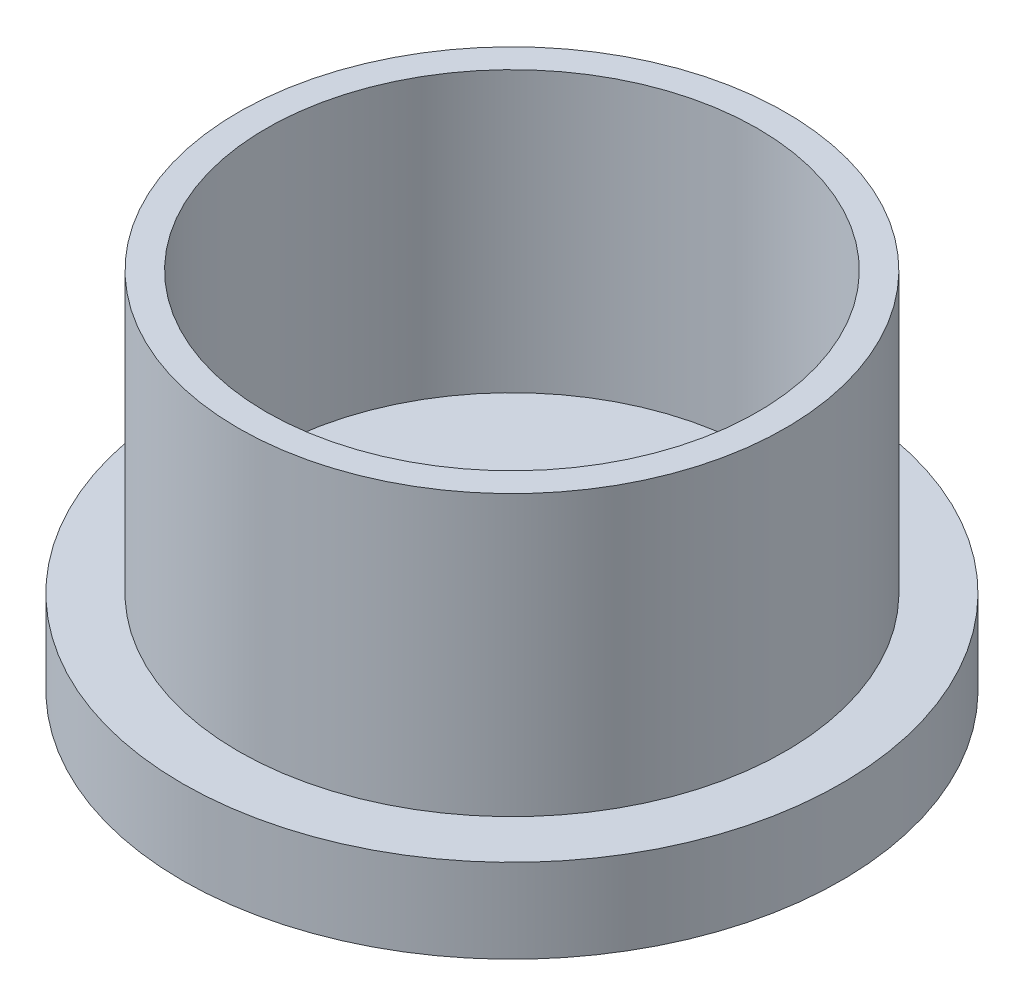
ISO-10303-21;
HEADER;
FILE_DESCRIPTION(('STEP AP214'),'2;1');
FILE_NAME('part.step','',(''),(''),'','','');
FILE_SCHEMA(('AUTOMOTIVE_DESIGN { 1 0 10303 214 1 1 1 1 }'));
ENDSEC;
DATA;
#1=APPLICATION_CONTEXT('core data for automotive mechanical design processes');
#2=APPLICATION_PROTOCOL_DEFINITION('international standard','automotive_design',2000,#1);
#3=PRODUCT_CONTEXT('',#1,'mechanical');
#4=PRODUCT('Part','Part','',(#3));
#5=PRODUCT_RELATED_PRODUCT_CATEGORY('part','',(#4));
#6=PRODUCT_DEFINITION_FORMATION('','',#4);
#7=PRODUCT_DEFINITION_CONTEXT('part definition',#1,'design');
#8=PRODUCT_DEFINITION('design','',#6,#7);
#9=PRODUCT_DEFINITION_SHAPE('','',#8);
#10=(LENGTH_UNIT() NAMED_UNIT(*) SI_UNIT(.MILLI.,.METRE.));
#11=(NAMED_UNIT(*) PLANE_ANGLE_UNIT() SI_UNIT($,.RADIAN.));
#12=(NAMED_UNIT(*) SI_UNIT($,.STERADIAN.) SOLID_ANGLE_UNIT());
#13=UNCERTAINTY_MEASURE_WITH_UNIT(LENGTH_MEASURE(1.E-05),#10,'distance_accuracy_value','');
#14=(GEOMETRIC_REPRESENTATION_CONTEXT(3) GLOBAL_UNCERTAINTY_ASSIGNED_CONTEXT((#13)) GLOBAL_UNIT_ASSIGNED_CONTEXT((#10,
#11,#12)) REPRESENTATION_CONTEXT('',''));
#15=CARTESIAN_POINT('',(0.,0.,0.));
#16=DIRECTION('',(0.,0.,1.));
#17=DIRECTION('',(1.,0.,0.));
#18=AXIS2_PLACEMENT_3D('',#15,#16,#17);
#19=CARTESIAN_POINT('',(-7.78,0.,-0.25));
#20=DIRECTION('',(0.,0.,1.));
#21=DIRECTION('',(1.,0.,0.));
#22=AXIS2_PLACEMENT_3D('',#19,#20,#21);
#23=PLANE('',#22);
#24=DIRECTION('',(0.,1.,0.));
#25=VECTOR('',#24,1.);
#26=CARTESIAN_POINT('',(0.25,0.,-0.25));
#27=LINE('',#26,#25);
#28=CARTESIAN_POINT('',(0.25,0.,-0.25));
#29=VERTEX_POINT('',#28);
#30=CARTESIAN_POINT('',(0.25,3.,-0.25));
#31=VERTEX_POINT('',#30);
#32=EDGE_CURVE('E142',#29,#31,#27,.T.);
#33=ORIENTED_EDGE('',*,*,#32,.F.);
#34=DIRECTION('',(1.,0.,0.));
#35=VECTOR('',#34,1.);
#36=CARTESIAN_POINT('',(-7.78,0.,-0.25));
#37=LINE('',#36,#35);
#38=CARTESIAN_POINT('',(7.78,0.,-0.25));
#39=VERTEX_POINT('',#38);
#40=EDGE_CURVE('E175',#29,#39,#37,.T.);
#41=ORIENTED_EDGE('',*,*,#40,.T.);
#42=DIRECTION('',(0.,1.,0.));
#43=VECTOR('',#42,1.);
#44=CARTESIAN_POINT('',(7.78,0.,-0.25));
#45=LINE('',#44,#43);
#46=CARTESIAN_POINT('',(7.78,3.,-0.25));
#47=VERTEX_POINT('',#46);
#48=EDGE_CURVE('E194',#39,#47,#45,.T.);
#49=ORIENTED_EDGE('',*,*,#48,.T.);
#50=DIRECTION('',(1.,0.,0.));
#51=VECTOR('',#50,1.);
#52=CARTESIAN_POINT('',(-7.78,3.,-0.25));
#53=LINE('',#52,#51);
#54=EDGE_CURVE('E188',#31,#47,#53,.T.);
#55=ORIENTED_EDGE('',*,*,#54,.F.);
#56=EDGE_LOOP('',(#33,#41,#49,#55));
#57=FACE_BOUND('',#56,.T.);
#58=ADVANCED_FACE('F33',(#57),#23,.T.);
#59=CARTESIAN_POINT('',(-7.78,0.,0.25));
#60=DIRECTION('',(0.,0.,1.));
#61=DIRECTION('',(1.,0.,0.));
#62=AXIS2_PLACEMENT_3D('',#59,#60,#61);
#63=PLANE('',#62);
#64=DIRECTION('',(1.,0.,0.));
#65=VECTOR('',#64,1.);
#66=CARTESIAN_POINT('',(-7.78,0.,0.25));
#67=LINE('',#66,#65);
#68=CARTESIAN_POINT('',(0.25,0.,0.25));
#69=VERTEX_POINT('',#68);
#70=CARTESIAN_POINT('',(7.78,0.,0.25));
#71=VERTEX_POINT('',#70);
#72=EDGE_CURVE('E56',#69,#71,#67,.T.);
#73=ORIENTED_EDGE('',*,*,#72,.F.);
#74=DIRECTION('',(0.,1.,0.));
#75=VECTOR('',#74,1.);
#76=CARTESIAN_POINT('',(0.25,0.,0.25));
#77=LINE('',#76,#75);
#78=CARTESIAN_POINT('',(0.250000000000002,3.,0.25));
#79=VERTEX_POINT('',#78);
#80=EDGE_CURVE('E11',#69,#79,#77,.T.);
#81=ORIENTED_EDGE('',*,*,#80,.T.);
#82=DIRECTION('',(1.,0.,0.));
#83=VECTOR('',#82,1.);
#84=CARTESIAN_POINT('',(-7.78,3.,0.25));
#85=LINE('',#84,#83);
#86=CARTESIAN_POINT('',(7.78,3.,0.25));
#87=VERTEX_POINT('',#86);
#88=EDGE_CURVE('E182',#79,#87,#85,.T.);
#89=ORIENTED_EDGE('',*,*,#88,.T.);
#90=DIRECTION('',(0.,1.,0.));
#91=VECTOR('',#90,1.);
#92=CARTESIAN_POINT('',(7.78,0.,0.25));
#93=LINE('',#92,#91);
#94=EDGE_CURVE('E197',#71,#87,#93,.T.);
#95=ORIENTED_EDGE('',*,*,#94,.F.);
#96=EDGE_LOOP('',(#73,#81,#89,#95));
#97=FACE_BOUND('',#96,.T.);
#98=ADVANCED_FACE('F245',(#97),#63,.F.);
#99=CARTESIAN_POINT('',(0.,3.,0.));
#100=DIRECTION('',(0.,-1.,0.));
#101=DIRECTION('',(0.,0.,-1.));
#102=AXIS2_PLACEMENT_3D('',#99,#100,#101);
#103=CYLINDRICAL_SURFACE('',#102,11.78);
#104=CARTESIAN_POINT('',(0.,3.,0.));
#105=DIRECTION('',(0.,1.,0.));
#106=DIRECTION('',(0.,0.,1.));
#107=AXIS2_PLACEMENT_3D('',#104,#105,#106);
#108=CIRCLE('',#107,11.78);
#109=CARTESIAN_POINT('',(0.,3.,11.78));
#110=VERTEX_POINT('',#109);
#111=EDGE_CURVE('E202',#110,#110,#108,.T.);
#112=ORIENTED_EDGE('',*,*,#111,.F.);
#113=EDGE_LOOP('',(#112));
#114=FACE_BOUND('',#113,.T.);
#115=CARTESIAN_POINT('',(0.,0.,0.));
#116=DIRECTION('',(0.,1.,0.));
#117=DIRECTION('',(0.,0.,1.));
#118=AXIS2_PLACEMENT_3D('',#115,#116,#117);
#119=CIRCLE('',#118,11.78);
#120=CARTESIAN_POINT('',(0.,0.,11.78));
#121=VERTEX_POINT('',#120);
#122=EDGE_CURVE('E193',#121,#121,#119,.T.);
#123=ORIENTED_EDGE('',*,*,#122,.T.);
#124=EDGE_LOOP('',(#123));
#125=FACE_BOUND('',#124,.T.);
#126=ADVANCED_FACE('F35',(#114,#125),#103,.T.);
#127=CARTESIAN_POINT('',(0.,3.,0.));
#128=DIRECTION('',(0.,1.,0.));
#129=DIRECTION('',(0.,0.,1.));
#130=AXIS2_PLACEMENT_3D('',#127,#128,#129);
#131=PLANE('',#130);
#132=CARTESIAN_POINT('',(0.,3.,0.));
#133=DIRECTION('',(0.,1.,0.));
#134=DIRECTION('',(0.,0.,1.));
#135=AXIS2_PLACEMENT_3D('',#132,#133,#134);
#136=CIRCLE('',#135,9.78);
#137=CARTESIAN_POINT('',(0.,3.,9.78));
#138=VERTEX_POINT('',#137);
#139=EDGE_CURVE('E277',#138,#138,#136,.T.);
#140=ORIENTED_EDGE('',*,*,#139,.F.);
#141=EDGE_LOOP('',(#140));
#142=FACE_BOUND('',#141,.T.);
#143=ORIENTED_EDGE('',*,*,#111,.T.);
#144=EDGE_LOOP('',(#143));
#145=FACE_BOUND('',#144,.T.);
#146=ADVANCED_FACE('F308',(#142,#145),#131,.T.);
#147=CARTESIAN_POINT('',(0.,0.,0.));
#148=DIRECTION('',(0.,1.,0.));
#149=DIRECTION('',(0.,0.,1.));
#150=AXIS2_PLACEMENT_3D('',#147,#148,#149);
#151=PLANE('',#150);
#152=DIRECTION('',(1.,0.,0.));
#153=VECTOR('',#152,1.);
#154=CARTESIAN_POINT('',(-0.249999999999999,0.,7.78));
#155=LINE('',#154,#153);
#156=CARTESIAN_POINT('',(-0.249999999999999,0.,7.78));
#157=VERTEX_POINT('',#156);
#158=CARTESIAN_POINT('',(0.250000000000001,0.,7.78));
#159=VERTEX_POINT('',#158);
#160=EDGE_CURVE('E151',#157,#159,#155,.T.);
#161=ORIENTED_EDGE('',*,*,#160,.T.);
#162=DIRECTION('',(0.,0.,-1.));
#163=VECTOR('',#162,1.);
#164=CARTESIAN_POINT('',(0.249999999999999,0.,-7.78));
#165=LINE('',#164,#163);
#166=EDGE_CURVE('E275',#159,#69,#165,.T.);
#167=ORIENTED_EDGE('',*,*,#166,.T.);
#168=ORIENTED_EDGE('',*,*,#72,.T.);
#169=DIRECTION('',(0.,0.,1.));
#170=VECTOR('',#169,1.);
#171=CARTESIAN_POINT('',(7.78,0.,-0.25));
#172=LINE('',#171,#170);
#173=EDGE_CURVE('E172',#39,#71,#172,.T.);
#174=ORIENTED_EDGE('',*,*,#173,.F.);
#175=ORIENTED_EDGE('',*,*,#40,.F.);
#176=CARTESIAN_POINT('',(0.249999999999999,0.,-7.78));
#177=VERTEX_POINT('',#176);
#178=EDGE_CURVE('E224',#29,#177,#165,.T.);
#179=ORIENTED_EDGE('',*,*,#178,.T.);
#180=DIRECTION('',(-1.,0.,0.));
#181=VECTOR('',#180,1.);
#182=CARTESIAN_POINT('',(-0.250000000000001,0.,-7.78));
#183=LINE('',#182,#181);
#184=CARTESIAN_POINT('',(-0.250000000000001,0.,-7.78));
#185=VERTEX_POINT('',#184);
#186=EDGE_CURVE('E148',#177,#185,#183,.T.);
#187=ORIENTED_EDGE('',*,*,#186,.T.);
#188=DIRECTION('',(0.,0.,1.));
#189=VECTOR('',#188,1.);
#190=CARTESIAN_POINT('',(-0.250000000000001,0.,-7.78));
#191=LINE('',#190,#189);
#192=CARTESIAN_POINT('',(-0.25,0.,-0.25));
#193=VERTEX_POINT('',#192);
#194=EDGE_CURVE('E156',#185,#193,#191,.T.);
#195=ORIENTED_EDGE('',*,*,#194,.T.);
#196=CARTESIAN_POINT('',(-7.78,0.,-0.25));
#197=VERTEX_POINT('',#196);
#198=EDGE_CURVE('E176',#197,#193,#37,.T.);
#199=ORIENTED_EDGE('',*,*,#198,.F.);
#200=DIRECTION('',(0.,0.,1.));
#201=VECTOR('',#200,1.);
#202=CARTESIAN_POINT('',(-7.78,0.,-0.25));
#203=LINE('',#202,#201);
#204=CARTESIAN_POINT('',(-7.78,0.,0.25));
#205=VERTEX_POINT('',#204);
#206=EDGE_CURVE('E165',#197,#205,#203,.T.);
#207=ORIENTED_EDGE('',*,*,#206,.T.);
#208=CARTESIAN_POINT('',(-0.250000000000001,0.,0.25));
#209=VERTEX_POINT('',#208);
#210=EDGE_CURVE('E169',#205,#209,#67,.T.);
#211=ORIENTED_EDGE('',*,*,#210,.T.);
#212=EDGE_CURVE('E48',#209,#157,#191,.T.);
#213=ORIENTED_EDGE('',*,*,#212,.T.);
#214=EDGE_LOOP('',(#161,#167,#168,#174,#175,#179,#187,#195,#199,#207,#211,#213));
#215=FACE_BOUND('',#214,.T.);
#216=ORIENTED_EDGE('',*,*,#122,.F.);
#217=EDGE_LOOP('',(#216));
#218=FACE_BOUND('',#217,.T.);
#219=ADVANCED_FACE('F210',(#215,#218),#151,.F.);
#220=CARTESIAN_POINT('',(-7.78,0.,-0.25));
#221=DIRECTION('',(-1.,0.,0.));
#222=DIRECTION('',(0.,0.,1.));
#223=AXIS2_PLACEMENT_3D('',#220,#221,#222);
#224=PLANE('',#223);
#225=DIRECTION('',(0.,0.,1.));
#226=VECTOR('',#225,1.);
#227=CARTESIAN_POINT('',(-7.78,3.,-0.25));
#228=LINE('',#227,#226);
#229=CARTESIAN_POINT('',(-7.78,3.,-0.25));
#230=VERTEX_POINT('',#229);
#231=CARTESIAN_POINT('',(-7.78,3.,0.25));
#232=VERTEX_POINT('',#231);
#233=EDGE_CURVE('E164',#230,#232,#228,.T.);
#234=ORIENTED_EDGE('',*,*,#233,.T.);
#235=DIRECTION('',(0.,1.,0.));
#236=VECTOR('',#235,1.);
#237=CARTESIAN_POINT('',(-7.78,0.,0.25));
#238=LINE('',#237,#236);
#239=EDGE_CURVE('E179',#205,#232,#238,.T.);
#240=ORIENTED_EDGE('',*,*,#239,.F.);
#241=ORIENTED_EDGE('',*,*,#206,.F.);
#242=DIRECTION('',(0.,1.,0.));
#243=VECTOR('',#242,1.);
#244=CARTESIAN_POINT('',(-7.78,0.,-0.25));
#245=LINE('',#244,#243);
#246=EDGE_CURVE('E190',#197,#230,#245,.T.);
#247=ORIENTED_EDGE('',*,*,#246,.T.);
#248=EDGE_LOOP('',(#234,#240,#241,#247));
#249=FACE_BOUND('',#248,.T.);
#250=ADVANCED_FACE('F216',(#249),#224,.F.);
#251=DIRECTION('',(0.,-1.,0.));
#252=VECTOR('',#251,1.);
#253=CARTESIAN_POINT('',(-0.25,0.,-0.25));
#254=LINE('',#253,#252);
#255=CARTESIAN_POINT('',(-0.25,3.,-0.25));
#256=VERTEX_POINT('',#255);
#257=EDGE_CURVE('E160',#256,#193,#254,.T.);
#258=ORIENTED_EDGE('',*,*,#257,.F.);
#259=EDGE_CURVE('E168',#230,#256,#53,.T.);
#260=ORIENTED_EDGE('',*,*,#259,.F.);
#261=ORIENTED_EDGE('',*,*,#246,.F.);
#262=ORIENTED_EDGE('',*,*,#198,.T.);
#263=EDGE_LOOP('',(#258,#260,#261,#262));
#264=FACE_BOUND('',#263,.T.);
#265=ADVANCED_FACE('F248',(#264),#23,.T.);
#266=CARTESIAN_POINT('',(7.78,0.,-0.25));
#267=DIRECTION('',(-1.,0.,0.));
#268=DIRECTION('',(0.,0.,1.));
#269=AXIS2_PLACEMENT_3D('',#266,#267,#268);
#270=PLANE('',#269);
#271=DIRECTION('',(0.,0.,1.));
#272=VECTOR('',#271,1.);
#273=CARTESIAN_POINT('',(7.78,3.,-0.25));
#274=LINE('',#273,#272);
#275=EDGE_CURVE('E186',#47,#87,#274,.T.);
#276=ORIENTED_EDGE('',*,*,#275,.F.);
#277=ORIENTED_EDGE('',*,*,#48,.F.);
#278=ORIENTED_EDGE('',*,*,#173,.T.);
#279=ORIENTED_EDGE('',*,*,#94,.T.);
#280=EDGE_LOOP('',(#276,#277,#278,#279));
#281=FACE_BOUND('',#280,.T.);
#282=ADVANCED_FACE('F256',(#281),#270,.T.);
#283=CARTESIAN_POINT('',(-0.250000000000001,3.,0.25));
#284=VERTEX_POINT('',#283);
#285=EDGE_CURVE('E183',#232,#284,#85,.T.);
#286=ORIENTED_EDGE('',*,*,#285,.T.);
#287=DIRECTION('',(0.,-1.,0.));
#288=VECTOR('',#287,1.);
#289=CARTESIAN_POINT('',(-0.25,0.,0.25));
#290=LINE('',#289,#288);
#291=EDGE_CURVE('E41',#284,#209,#290,.T.);
#292=ORIENTED_EDGE('',*,*,#291,.T.);
#293=ORIENTED_EDGE('',*,*,#210,.F.);
#294=ORIENTED_EDGE('',*,*,#239,.T.);
#295=EDGE_LOOP('',(#286,#292,#293,#294));
#296=FACE_BOUND('',#295,.T.);
#297=ADVANCED_FACE('F208',(#296),#63,.F.);
#298=CARTESIAN_POINT('',(0.249999999999999,0.,-7.78));
#299=DIRECTION('',(1.,0.,0.));
#300=DIRECTION('',(0.,0.,-1.));
#301=AXIS2_PLACEMENT_3D('',#298,#299,#300);
#302=PLANE('',#301);
#303=ORIENTED_EDGE('',*,*,#166,.F.);
#304=DIRECTION('',(0.,1.,0.));
#305=VECTOR('',#304,1.);
#306=CARTESIAN_POINT('',(0.250000000000001,0.,7.78));
#307=LINE('',#306,#305);
#308=CARTESIAN_POINT('',(0.250000000000001,3.,7.78));
#309=VERTEX_POINT('',#308);
#310=EDGE_CURVE('E162',#159,#309,#307,.T.);
#311=ORIENTED_EDGE('',*,*,#310,.T.);
#312=DIRECTION('',(0.,0.,-1.));
#313=VECTOR('',#312,1.);
#314=CARTESIAN_POINT('',(0.249999999999999,3.,-7.78));
#315=LINE('',#314,#313);
#316=EDGE_CURVE('E135',#309,#79,#315,.T.);
#317=ORIENTED_EDGE('',*,*,#316,.T.);
#318=ORIENTED_EDGE('',*,*,#80,.F.);
#319=EDGE_LOOP('',(#303,#311,#317,#318));
#320=FACE_BOUND('',#319,.T.);
#321=ADVANCED_FACE('F231',(#320),#302,.F.);
#322=CARTESIAN_POINT('',(-0.250000000000001,0.,-7.78));
#323=DIRECTION('',(-1.,0.,0.));
#324=DIRECTION('',(0.,0.,1.));
#325=AXIS2_PLACEMENT_3D('',#322,#323,#324);
#326=PLANE('',#325);
#327=DIRECTION('',(0.,0.,1.));
#328=VECTOR('',#327,1.);
#329=CARTESIAN_POINT('',(-0.250000000000001,3.,-7.78));
#330=LINE('',#329,#328);
#331=CARTESIAN_POINT('',(-0.249999999999999,3.,7.78));
#332=VERTEX_POINT('',#331);
#333=EDGE_CURVE('E134',#284,#332,#330,.T.);
#334=ORIENTED_EDGE('',*,*,#333,.T.);
#335=DIRECTION('',(0.,1.,0.));
#336=VECTOR('',#335,1.);
#337=CARTESIAN_POINT('',(-0.249999999999999,0.,7.78));
#338=LINE('',#337,#336);
#339=EDGE_CURVE('E153',#157,#332,#338,.T.);
#340=ORIENTED_EDGE('',*,*,#339,.F.);
#341=ORIENTED_EDGE('',*,*,#212,.F.);
#342=ORIENTED_EDGE('',*,*,#291,.F.);
#343=EDGE_LOOP('',(#334,#340,#341,#342));
#344=FACE_BOUND('',#343,.T.);
#345=ADVANCED_FACE('F229',(#344),#326,.F.);
#346=CARTESIAN_POINT('',(-0.249999999999999,0.,7.78));
#347=DIRECTION('',(0.,0.,1.));
#348=DIRECTION('',(1.,0.,0.));
#349=AXIS2_PLACEMENT_3D('',#346,#347,#348);
#350=PLANE('',#349);
#351=DIRECTION('',(1.,0.,0.));
#352=VECTOR('',#351,1.);
#353=CARTESIAN_POINT('',(-0.249999999999999,3.,7.78));
#354=LINE('',#353,#352);
#355=EDGE_CURVE('E219',#332,#309,#354,.T.);
#356=ORIENTED_EDGE('',*,*,#355,.T.);
#357=ORIENTED_EDGE('',*,*,#310,.F.);
#358=ORIENTED_EDGE('',*,*,#160,.F.);
#359=ORIENTED_EDGE('',*,*,#339,.T.);
#360=EDGE_LOOP('',(#356,#357,#358,#359));
#361=FACE_BOUND('',#360,.T.);
#362=ADVANCED_FACE('F228',(#361),#350,.F.);
#363=ORIENTED_EDGE('',*,*,#32,.T.);
#364=CARTESIAN_POINT('',(0.249999999999999,3.,-7.78));
#365=VERTEX_POINT('',#364);
#366=EDGE_CURVE('E127',#31,#365,#315,.T.);
#367=ORIENTED_EDGE('',*,*,#366,.T.);
#368=DIRECTION('',(0.,1.,0.));
#369=VECTOR('',#368,1.);
#370=CARTESIAN_POINT('',(0.249999999999999,0.,-7.78));
#371=LINE('',#370,#369);
#372=EDGE_CURVE('E139',#177,#365,#371,.T.);
#373=ORIENTED_EDGE('',*,*,#372,.F.);
#374=ORIENTED_EDGE('',*,*,#178,.F.);
#375=EDGE_LOOP('',(#363,#367,#373,#374));
#376=FACE_BOUND('',#375,.T.);
#377=ADVANCED_FACE('F138',(#376),#302,.F.);
#378=ORIENTED_EDGE('',*,*,#257,.T.);
#379=ORIENTED_EDGE('',*,*,#194,.F.);
#380=DIRECTION('',(0.,1.,0.));
#381=VECTOR('',#380,1.);
#382=CARTESIAN_POINT('',(-0.250000000000001,0.,-7.78));
#383=LINE('',#382,#381);
#384=CARTESIAN_POINT('',(-0.250000000000001,3.,-7.78));
#385=VERTEX_POINT('',#384);
#386=EDGE_CURVE('E150',#185,#385,#383,.T.);
#387=ORIENTED_EDGE('',*,*,#386,.T.);
#388=EDGE_CURVE('E130',#385,#256,#330,.T.);
#389=ORIENTED_EDGE('',*,*,#388,.T.);
#390=EDGE_LOOP('',(#378,#379,#387,#389));
#391=FACE_BOUND('',#390,.T.);
#392=ADVANCED_FACE('F233',(#391),#326,.F.);
#393=CARTESIAN_POINT('',(-0.250000000000001,0.,-7.78));
#394=DIRECTION('',(0.,0.,-1.));
#395=DIRECTION('',(-1.,0.,0.));
#396=AXIS2_PLACEMENT_3D('',#393,#394,#395);
#397=PLANE('',#396);
#398=DIRECTION('',(-1.,0.,0.));
#399=VECTOR('',#398,1.);
#400=CARTESIAN_POINT('',(-0.250000000000001,3.,-7.78));
#401=LINE('',#400,#399);
#402=EDGE_CURVE('E124',#365,#385,#401,.T.);
#403=ORIENTED_EDGE('',*,*,#402,.T.);
#404=ORIENTED_EDGE('',*,*,#386,.F.);
#405=ORIENTED_EDGE('',*,*,#186,.F.);
#406=ORIENTED_EDGE('',*,*,#372,.T.);
#407=EDGE_LOOP('',(#403,#404,#405,#406));
#408=FACE_BOUND('',#407,.T.);
#409=ADVANCED_FACE('F146',(#408),#397,.F.);
#410=CARTESIAN_POINT('',(0.,13.,0.));
#411=DIRECTION('',(0.,-1.,0.));
#412=DIRECTION('',(0.,0.,-1.));
#413=AXIS2_PLACEMENT_3D('',#410,#411,#412);
#414=CYLINDRICAL_SURFACE('',#413,9.78);
#415=CARTESIAN_POINT('',(0.,13.,0.));
#416=DIRECTION('',(0.,1.,0.));
#417=DIRECTION('',(0.,0.,1.));
#418=AXIS2_PLACEMENT_3D('',#415,#416,#417);
#419=CIRCLE('',#418,9.78);
#420=CARTESIAN_POINT('',(0.,13.,9.78));
#421=VERTEX_POINT('',#420);
#422=EDGE_CURVE('E144',#421,#421,#419,.T.);
#423=ORIENTED_EDGE('',*,*,#422,.F.);
#424=EDGE_LOOP('',(#423));
#425=FACE_BOUND('',#424,.T.);
#426=ORIENTED_EDGE('',*,*,#139,.T.);
#427=EDGE_LOOP('',(#426));
#428=FACE_BOUND('',#427,.T.);
#429=ADVANCED_FACE('F299',(#425,#428),#414,.T.);
#430=CARTESIAN_POINT('',(0.,13.,0.));
#431=DIRECTION('',(0.,1.,0.));
#432=DIRECTION('',(0.,0.,1.));
#433=AXIS2_PLACEMENT_3D('',#430,#431,#432);
#434=PLANE('',#433);
#435=CARTESIAN_POINT('',(0.,13.,0.));
#436=DIRECTION('',(0.,1.,0.));
#437=DIRECTION('',(0.,0.,1.));
#438=AXIS2_PLACEMENT_3D('',#435,#436,#437);
#439=CIRCLE('',#438,8.78);
#440=CARTESIAN_POINT('',(0.,13.,8.78));
#441=VERTEX_POINT('',#440);
#442=EDGE_CURVE('E283',#441,#441,#439,.T.);
#443=ORIENTED_EDGE('',*,*,#442,.F.);
#444=EDGE_LOOP('',(#443));
#445=FACE_BOUND('',#444,.T.);
#446=ORIENTED_EDGE('',*,*,#422,.T.);
#447=EDGE_LOOP('',(#446));
#448=FACE_BOUND('',#447,.T.);
#449=ADVANCED_FACE('F296',(#445,#448),#434,.T.);
#450=CARTESIAN_POINT('',(0.,3.,0.));
#451=DIRECTION('',(0.,1.,0.));
#452=DIRECTION('',(0.,0.,1.));
#453=AXIS2_PLACEMENT_3D('',#450,#451,#452);
#454=PLANE('',#453);
#455=CARTESIAN_POINT('',(0.,3.,0.));
#456=DIRECTION('',(0.,1.,0.));
#457=DIRECTION('',(0.,0.,1.));
#458=AXIS2_PLACEMENT_3D('',#455,#456,#457);
#459=CIRCLE('',#458,8.78);
#460=CARTESIAN_POINT('',(0.,3.,8.78));
#461=VERTEX_POINT('',#460);
#462=EDGE_CURVE('E280',#461,#461,#459,.T.);
#463=ORIENTED_EDGE('',*,*,#462,.T.);
#464=EDGE_LOOP('',(#463));
#465=FACE_BOUND('',#464,.T.);
#466=ORIENTED_EDGE('',*,*,#355,.F.);
#467=ORIENTED_EDGE('',*,*,#333,.F.);
#468=ORIENTED_EDGE('',*,*,#285,.F.);
#469=ORIENTED_EDGE('',*,*,#233,.F.);
#470=ORIENTED_EDGE('',*,*,#259,.T.);
#471=ORIENTED_EDGE('',*,*,#388,.F.);
#472=ORIENTED_EDGE('',*,*,#402,.F.);
#473=ORIENTED_EDGE('',*,*,#366,.F.);
#474=ORIENTED_EDGE('',*,*,#54,.T.);
#475=ORIENTED_EDGE('',*,*,#275,.T.);
#476=ORIENTED_EDGE('',*,*,#88,.F.);
#477=ORIENTED_EDGE('',*,*,#316,.F.);
#478=EDGE_LOOP('',(#466,#467,#468,#469,#470,#471,#472,#473,#474,#475,#476,#477));
#479=FACE_BOUND('',#478,.T.);
#480=ADVANCED_FACE('F126',(#465,#479),#454,.T.);
#481=CARTESIAN_POINT('',(0.,3.,0.));
#482=DIRECTION('',(0.,1.,0.));
#483=DIRECTION('',(0.,0.,1.));
#484=AXIS2_PLACEMENT_3D('',#481,#482,#483);
#485=CYLINDRICAL_SURFACE('',#484,8.78);
#486=ORIENTED_EDGE('',*,*,#462,.F.);
#487=EDGE_LOOP('',(#486));
#488=FACE_BOUND('',#487,.T.);
#489=ORIENTED_EDGE('',*,*,#442,.T.);
#490=EDGE_LOOP('',(#489));
#491=FACE_BOUND('',#490,.T.);
#492=ADVANCED_FACE('F290',(#488,#491),#485,.F.);
#493=CLOSED_SHELL('',(#58,#98,#126,#146,#219,#250,#265,#282,#297,#321,#345,#362,#377,#392,#409,
#429,#449,#480,#492));
#494=MANIFOLD_SOLID_BREP('B2',#493);
#495=ADVANCED_BREP_SHAPE_REPRESENTATION('',(#18,#494),#14);
#496=SHAPE_DEFINITION_REPRESENTATION(#9,#495);
ENDSEC;
END-ISO-10303-21;
